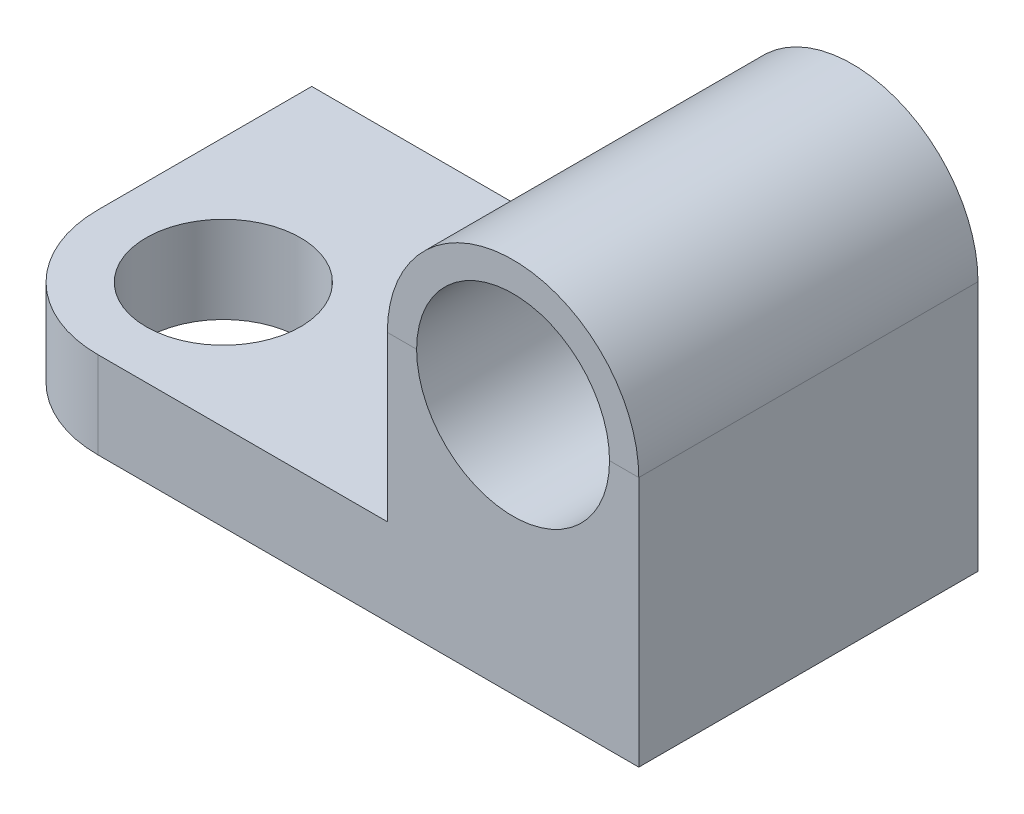
ISO-10303-21;
HEADER;
FILE_DESCRIPTION(('STEP AP214'),'2;1');
FILE_NAME('part.step','',(''),(''),'','','');
FILE_SCHEMA(('AUTOMOTIVE_DESIGN { 1 0 10303 214 1 1 1 1 }'));
ENDSEC;
DATA;
#1=APPLICATION_CONTEXT('core data for automotive mechanical design processes');
#2=APPLICATION_PROTOCOL_DEFINITION('international standard','automotive_design',2000,#1);
#3=PRODUCT_CONTEXT('',#1,'mechanical');
#4=PRODUCT('Part','Part','',(#3));
#5=PRODUCT_RELATED_PRODUCT_CATEGORY('part','',(#4));
#6=PRODUCT_DEFINITION_FORMATION('','',#4);
#7=PRODUCT_DEFINITION_CONTEXT('part definition',#1,'design');
#8=PRODUCT_DEFINITION('design','',#6,#7);
#9=PRODUCT_DEFINITION_SHAPE('','',#8);
#10=(LENGTH_UNIT() NAMED_UNIT(*) SI_UNIT(.MILLI.,.METRE.));
#11=(NAMED_UNIT(*) PLANE_ANGLE_UNIT() SI_UNIT($,.RADIAN.));
#12=(NAMED_UNIT(*) SI_UNIT($,.STERADIAN.) SOLID_ANGLE_UNIT());
#13=UNCERTAINTY_MEASURE_WITH_UNIT(LENGTH_MEASURE(1.E-05),#10,'distance_accuracy_value','');
#14=(GEOMETRIC_REPRESENTATION_CONTEXT(3) GLOBAL_UNCERTAINTY_ASSIGNED_CONTEXT((#13)) GLOBAL_UNIT_ASSIGNED_CONTEXT((#10,
#11,#12)) REPRESENTATION_CONTEXT('',''));
#15=CARTESIAN_POINT('',(0.,0.,0.));
#16=DIRECTION('',(0.,0.,1.));
#17=DIRECTION('',(1.,0.,0.));
#18=AXIS2_PLACEMENT_3D('',#15,#16,#17);
#19=CARTESIAN_POINT('',(13.,9.,0.));
#20=DIRECTION('',(0.,0.,-1.));
#21=DIRECTION('',(-1.,0.,0.));
#22=AXIS2_PLACEMENT_3D('',#19,#20,#21);
#23=PLANE('',#22);
#24=CARTESIAN_POINT('',(56.032299844366,26.,0.));
#25=DIRECTION('',(0.,0.,1.));
#26=DIRECTION('',(-1.,0.,0.));
#27=AXIS2_PLACEMENT_3D('',#24,#25,#26);
#28=CIRCLE('',#27,9.99999999999999);
#29=CARTESIAN_POINT('',(46.032299844366,26.,0.000250000000001226));
#30=VERTEX_POINT('',#29);
#31=CARTESIAN_POINT('',(66.032299844366,26.,0.000249999999999491));
#32=VERTEX_POINT('',#31);
#33=EDGE_CURVE('E63',#30,#32,#28,.T.);
#34=ORIENTED_EDGE('',*,*,#33,.F.);
#35=CARTESIAN_POINT('',(43.,26.,0.0010000000000049));
#36=DIRECTION('',(1.,0.,0.));
#37=VECTOR('',#36,1.);
#38=LINE('',#35,#37);
#39=CARTESIAN_POINT('',(43.,26.,0.000500000000002452));
#40=VERTEX_POINT('',#39);
#41=EDGE_CURVE('E129',#40,#30,#38,.T.);
#42=ORIENTED_EDGE('',*,*,#41,.F.);
#43=DIRECTION('',(0.,-1.,0.));
#44=VECTOR('',#43,1.);
#45=CARTESIAN_POINT('',(43.,26.,0.));
#46=LINE('',#45,#44);
#47=CARTESIAN_POINT('',(43.,9.,0.));
#48=VERTEX_POINT('',#47);
#49=EDGE_CURVE('E219',#40,#48,#46,.T.);
#50=ORIENTED_EDGE('',*,*,#49,.T.);
#51=DIRECTION('',(1.,0.,0.));
#52=VECTOR('',#51,1.);
#53=CARTESIAN_POINT('',(13.,9.,0.));
#54=LINE('',#53,#52);
#55=CARTESIAN_POINT('',(13.,9.,0.));
#56=VERTEX_POINT('',#55);
#57=EDGE_CURVE('E278',#56,#48,#54,.T.);
#58=ORIENTED_EDGE('',*,*,#57,.F.);
#59=DIRECTION('',(0.,-1.,0.));
#60=VECTOR('',#59,1.);
#61=CARTESIAN_POINT('',(13.,9.,0.));
#62=LINE('',#61,#60);
#63=CARTESIAN_POINT('',(13.,0.,0.));
#64=VERTEX_POINT('',#63);
#65=EDGE_CURVE('E12',#56,#64,#62,.T.);
#66=ORIENTED_EDGE('',*,*,#65,.T.);
#67=DIRECTION('',(1.,0.,0.));
#68=VECTOR('',#67,1.);
#69=CARTESIAN_POINT('',(13.,0.,0.));
#70=LINE('',#69,#68);
#71=CARTESIAN_POINT('',(69.0645996887321,0.,0.));
#72=VERTEX_POINT('',#71);
#73=EDGE_CURVE('E291',#64,#72,#70,.T.);
#74=ORIENTED_EDGE('',*,*,#73,.T.);
#75=DIRECTION('',(0.,-1.,0.));
#76=VECTOR('',#75,1.);
#77=CARTESIAN_POINT('',(69.0645996887321,9.,0.));
#78=LINE('',#77,#76);
#79=CARTESIAN_POINT('',(69.0645996887321,26.,0.000500000000002452));
#80=VERTEX_POINT('',#79);
#81=EDGE_CURVE('E60',#80,#72,#78,.T.);
#82=ORIENTED_EDGE('',*,*,#81,.F.);
#83=CARTESIAN_POINT('',(66.032299844366,26.,0.0010000000000049));
#84=DIRECTION('',(1.,0.,0.));
#85=VECTOR('',#84,1.);
#86=LINE('',#83,#85);
#87=EDGE_CURVE('E127',#32,#80,#86,.T.);
#88=ORIENTED_EDGE('',*,*,#87,.F.);
#89=EDGE_LOOP('',(#34,#42,#50,#58,#66,#74,#82,#88));
#90=FACE_BOUND('',#89,.T.);
#91=ADVANCED_FACE('F46',(#90),#23,.F.);
#92=CARTESIAN_POINT('',(13.,9.,-13.));
#93=DIRECTION('',(0.,-1.,0.));
#94=DIRECTION('',(0.,0.,-1.));
#95=AXIS2_PLACEMENT_3D('',#92,#93,#94);
#96=CYLINDRICAL_SURFACE('',#95,13.);
#97=CARTESIAN_POINT('',(13.,0.,-13.));
#98=DIRECTION('',(0.,1.,0.));
#99=DIRECTION('',(0.,0.,1.));
#100=AXIS2_PLACEMENT_3D('',#97,#98,#99);
#101=CIRCLE('',#100,13.);
#102=CARTESIAN_POINT('',(0.,0.,-13.));
#103=VERTEX_POINT('',#102);
#104=EDGE_CURVE('E275',#103,#64,#101,.T.);
#105=ORIENTED_EDGE('',*,*,#104,.T.);
#106=ORIENTED_EDGE('',*,*,#65,.F.);
#107=CARTESIAN_POINT('',(13.,9.,-13.));
#108=DIRECTION('',(0.,1.,0.));
#109=DIRECTION('',(0.,0.,1.));
#110=AXIS2_PLACEMENT_3D('',#107,#108,#109);
#111=CIRCLE('',#110,13.);
#112=CARTESIAN_POINT('',(0.,9.,-13.));
#113=VERTEX_POINT('',#112);
#114=EDGE_CURVE('E273',#113,#56,#111,.T.);
#115=ORIENTED_EDGE('',*,*,#114,.F.);
#116=DIRECTION('',(0.,-1.,0.));
#117=VECTOR('',#116,1.);
#118=CARTESIAN_POINT('',(0.,9.,-13.));
#119=LINE('',#118,#117);
#120=EDGE_CURVE('E289',#113,#103,#119,.T.);
#121=ORIENTED_EDGE('',*,*,#120,.T.);
#122=EDGE_LOOP('',(#105,#106,#115,#121));
#123=FACE_BOUND('',#122,.T.);
#124=ADVANCED_FACE('F48',(#123),#96,.T.);
#125=CARTESIAN_POINT('',(69.0645996887321,9.,0.));
#126=DIRECTION('',(-1.,0.,0.));
#127=DIRECTION('',(0.,0.,1.));
#128=AXIS2_PLACEMENT_3D('',#125,#126,#127);
#129=PLANE('',#128);
#130=DIRECTION('',(0.,0.,-1.));
#131=VECTOR('',#130,1.);
#132=CARTESIAN_POINT('',(69.0645996887321,0.,0.));
#133=LINE('',#132,#131);
#134=CARTESIAN_POINT('',(69.0645996887321,0.,-35.1624539443944));
#135=VERTEX_POINT('',#134);
#136=EDGE_CURVE('E298',#72,#135,#133,.T.);
#137=ORIENTED_EDGE('',*,*,#136,.T.);
#138=DIRECTION('',(0.,-1.,0.));
#139=VECTOR('',#138,1.);
#140=CARTESIAN_POINT('',(69.0645996887321,9.,-35.1624539443944));
#141=LINE('',#140,#139);
#142=CARTESIAN_POINT('',(69.0645996887321,26.,-35.162454));
#143=VERTEX_POINT('',#142);
#144=EDGE_CURVE('E260',#143,#135,#141,.T.);
#145=ORIENTED_EDGE('',*,*,#144,.F.);
#146=DIRECTION('',(0.,0.,-1.));
#147=VECTOR('',#146,1.);
#148=CARTESIAN_POINT('',(69.0645996887321,26.,-35.1624539443944));
#149=LINE('',#148,#147);
#150=EDGE_CURVE('E136',#80,#143,#149,.T.);
#151=ORIENTED_EDGE('',*,*,#150,.F.);
#152=ORIENTED_EDGE('',*,*,#81,.T.);
#153=EDGE_LOOP('',(#137,#145,#151,#152));
#154=FACE_BOUND('',#153,.T.);
#155=ADVANCED_FACE('F189',(#154),#129,.F.);
#156=CARTESIAN_POINT('',(0.,9.,-35.1624539443944));
#157=DIRECTION('',(0.,0.,-1.));
#158=DIRECTION('',(-1.,0.,0.));
#159=AXIS2_PLACEMENT_3D('',#156,#157,#158);
#160=PLANE('',#159);
#161=CARTESIAN_POINT('',(56.032299844366,26.,-35.1624539443944));
#162=DIRECTION('',(0.,0.,-1.));
#163=DIRECTION('',(-1.,0.,0.));
#164=AXIS2_PLACEMENT_3D('',#161,#162,#163);
#165=CIRCLE('',#164,9.99999999999999);
#166=CARTESIAN_POINT('',(46.032299844366,26.,-35.1624539443944));
#167=VERTEX_POINT('',#166);
#168=EDGE_CURVE('E125',#167,#167,#165,.T.);
#169=ORIENTED_EDGE('',*,*,#168,.F.);
#170=EDGE_LOOP('',(#169));
#171=FACE_BOUND('',#170,.T.);
#172=DIRECTION('',(0.,-1.,0.));
#173=VECTOR('',#172,1.);
#174=CARTESIAN_POINT('',(43.,26.,-35.1624539443944));
#175=LINE('',#174,#173);
#176=CARTESIAN_POINT('',(43.,26.,-35.1624539443944));
#177=VERTEX_POINT('',#176);
#178=CARTESIAN_POINT('',(43.,9.,-35.1624539443944));
#179=VERTEX_POINT('',#178);
#180=EDGE_CURVE('E225',#177,#179,#175,.T.);
#181=ORIENTED_EDGE('',*,*,#180,.F.);
#182=CARTESIAN_POINT('',(56.032299844366,26.,-35.162454));
#183=DIRECTION('',(0.,0.,1.));
#184=DIRECTION('',(1.,0.,0.));
#185=AXIS2_PLACEMENT_3D('',#182,#183,#184);
#186=CIRCLE('',#185,13.032299844366);
#187=EDGE_CURVE('E224',#143,#177,#186,.T.);
#188=ORIENTED_EDGE('',*,*,#187,.F.);
#189=ORIENTED_EDGE('',*,*,#144,.T.);
#190=DIRECTION('',(1.,0.,0.));
#191=VECTOR('',#190,1.);
#192=CARTESIAN_POINT('',(0.,0.,-35.1624539443944));
#193=LINE('',#192,#191);
#194=CARTESIAN_POINT('',(0.,0.,-35.1624539443944));
#195=VERTEX_POINT('',#194);
#196=EDGE_CURVE('E297',#195,#135,#193,.T.);
#197=ORIENTED_EDGE('',*,*,#196,.F.);
#198=DIRECTION('',(0.,-1.,0.));
#199=VECTOR('',#198,1.);
#200=CARTESIAN_POINT('',(0.,9.,-35.1624539443944));
#201=LINE('',#200,#199);
#202=CARTESIAN_POINT('',(0.,9.,-35.1624539443944));
#203=VERTEX_POINT('',#202);
#204=EDGE_CURVE('E307',#203,#195,#201,.T.);
#205=ORIENTED_EDGE('',*,*,#204,.F.);
#206=DIRECTION('',(1.,0.,0.));
#207=VECTOR('',#206,1.);
#208=CARTESIAN_POINT('',(0.,9.,-35.1624539443944));
#209=LINE('',#208,#207);
#210=EDGE_CURVE('E246',#203,#179,#209,.T.);
#211=ORIENTED_EDGE('',*,*,#210,.T.);
#212=EDGE_LOOP('',(#181,#188,#189,#197,#205,#211));
#213=FACE_BOUND('',#212,.T.);
#214=ADVANCED_FACE('F191',(#171,#213),#160,.T.);
#215=CARTESIAN_POINT('',(0.,9.,-13.));
#216=DIRECTION('',(-1.,0.,0.));
#217=DIRECTION('',(0.,0.,1.));
#218=AXIS2_PLACEMENT_3D('',#215,#216,#217);
#219=PLANE('',#218);
#220=DIRECTION('',(0.,0.,-1.));
#221=VECTOR('',#220,1.);
#222=CARTESIAN_POINT('',(0.,0.,-13.));
#223=LINE('',#222,#221);
#224=EDGE_CURVE('E277',#103,#195,#223,.T.);
#225=ORIENTED_EDGE('',*,*,#224,.F.);
#226=ORIENTED_EDGE('',*,*,#120,.F.);
#227=DIRECTION('',(0.,0.,-1.));
#228=VECTOR('',#227,1.);
#229=CARTESIAN_POINT('',(0.,9.,-13.));
#230=LINE('',#229,#228);
#231=EDGE_CURVE('E284',#113,#203,#230,.T.);
#232=ORIENTED_EDGE('',*,*,#231,.T.);
#233=ORIENTED_EDGE('',*,*,#204,.T.);
#234=EDGE_LOOP('',(#225,#226,#232,#233));
#235=FACE_BOUND('',#234,.T.);
#236=ADVANCED_FACE('F196',(#235),#219,.T.);
#237=CARTESIAN_POINT('',(13.,9.,-13.));
#238=DIRECTION('',(0.,1.,0.));
#239=DIRECTION('',(0.,0.,1.));
#240=AXIS2_PLACEMENT_3D('',#237,#238,#239);
#241=PLANE('',#240);
#242=DIRECTION('',(0.,0.,1.));
#243=VECTOR('',#242,1.);
#244=CARTESIAN_POINT('',(43.,9.,-35.1624539443944));
#245=LINE('',#244,#243);
#246=EDGE_CURVE('E73',#179,#48,#245,.T.);
#247=ORIENTED_EDGE('',*,*,#246,.F.);
#248=ORIENTED_EDGE('',*,*,#210,.F.);
#249=ORIENTED_EDGE('',*,*,#231,.F.);
#250=ORIENTED_EDGE('',*,*,#114,.T.);
#251=ORIENTED_EDGE('',*,*,#57,.T.);
#252=EDGE_LOOP('',(#247,#248,#249,#250,#251));
#253=FACE_BOUND('',#252,.T.);
#254=CARTESIAN_POINT('',(13.,9.,-13.));
#255=DIRECTION('',(0.,1.,0.));
#256=DIRECTION('',(0.,0.,1.));
#257=AXIS2_PLACEMENT_3D('',#254,#255,#256);
#258=CIRCLE('',#257,8.);
#259=CARTESIAN_POINT('',(13.,9.,-5.));
#260=VERTEX_POINT('',#259);
#261=EDGE_CURVE('E265',#260,#260,#258,.T.);
#262=ORIENTED_EDGE('',*,*,#261,.F.);
#263=EDGE_LOOP('',(#262));
#264=FACE_BOUND('',#263,.T.);
#265=ADVANCED_FACE('F199',(#253,#264),#241,.T.);
#266=CARTESIAN_POINT('',(13.,0.,-13.));
#267=DIRECTION('',(0.,1.,0.));
#268=DIRECTION('',(0.,0.,1.));
#269=AXIS2_PLACEMENT_3D('',#266,#267,#268);
#270=PLANE('',#269);
#271=CARTESIAN_POINT('',(13.,0.,-13.));
#272=DIRECTION('',(0.,1.,0.));
#273=DIRECTION('',(0.,0.,1.));
#274=AXIS2_PLACEMENT_3D('',#271,#272,#273);
#275=CIRCLE('',#274,8.);
#276=CARTESIAN_POINT('',(13.,0.,-5.));
#277=VERTEX_POINT('',#276);
#278=EDGE_CURVE('E267',#277,#277,#275,.T.);
#279=ORIENTED_EDGE('',*,*,#278,.T.);
#280=EDGE_LOOP('',(#279));
#281=FACE_BOUND('',#280,.T.);
#282=ORIENTED_EDGE('',*,*,#104,.F.);
#283=ORIENTED_EDGE('',*,*,#224,.T.);
#284=ORIENTED_EDGE('',*,*,#196,.T.);
#285=ORIENTED_EDGE('',*,*,#136,.F.);
#286=ORIENTED_EDGE('',*,*,#73,.F.);
#287=EDGE_LOOP('',(#282,#283,#284,#285,#286));
#288=FACE_BOUND('',#287,.T.);
#289=ADVANCED_FACE('F205',(#281,#288),#270,.F.);
#290=CARTESIAN_POINT('',(13.,0.,-13.));
#291=DIRECTION('',(0.,1.,0.));
#292=DIRECTION('',(0.,0.,1.));
#293=AXIS2_PLACEMENT_3D('',#290,#291,#292);
#294=CYLINDRICAL_SURFACE('',#293,8.);
#295=ORIENTED_EDGE('',*,*,#278,.F.);
#296=EDGE_LOOP('',(#295));
#297=FACE_BOUND('',#296,.T.);
#298=ORIENTED_EDGE('',*,*,#261,.T.);
#299=EDGE_LOOP('',(#298));
#300=FACE_BOUND('',#299,.T.);
#301=ADVANCED_FACE('F201',(#297,#300),#294,.F.);
#302=CARTESIAN_POINT('',(43.,26.,-35.1624539443944));
#303=DIRECTION('',(1.,0.,0.));
#304=DIRECTION('',(0.,0.,-1.));
#305=AXIS2_PLACEMENT_3D('',#302,#303,#304);
#306=PLANE('',#305);
#307=ORIENTED_EDGE('',*,*,#246,.T.);
#308=ORIENTED_EDGE('',*,*,#49,.F.);
#309=DIRECTION('',(0.,0.,1.));
#310=VECTOR('',#309,1.);
#311=CARTESIAN_POINT('',(43.,26.,-35.1624539443944));
#312=LINE('',#311,#310);
#313=EDGE_CURVE('E180',#177,#40,#312,.T.);
#314=ORIENTED_EDGE('',*,*,#313,.F.);
#315=ORIENTED_EDGE('',*,*,#180,.T.);
#316=EDGE_LOOP('',(#307,#308,#314,#315));
#317=FACE_BOUND('',#316,.T.);
#318=ADVANCED_FACE('F208',(#317),#306,.F.);
#319=CARTESIAN_POINT('',(56.032299844366,26.,-35.162454));
#320=DIRECTION('',(0.,0.,1.));
#321=DIRECTION('',(1.,0.,0.));
#322=AXIS2_PLACEMENT_3D('',#319,#320,#321);
#323=CYLINDRICAL_SURFACE('',#322,13.032299844366);
#324=ORIENTED_EDGE('',*,*,#187,.T.);
#325=ORIENTED_EDGE('',*,*,#313,.T.);
#326=CARTESIAN_POINT('',(56.032299844366,26.,0.0010000000000049));
#327=DIRECTION('',(0.,0.,1.));
#328=DIRECTION('',(1.,0.,0.));
#329=AXIS2_PLACEMENT_3D('',#326,#327,#328);
#330=CIRCLE('',#329,13.032299844366);
#331=EDGE_CURVE('E138',#80,#40,#330,.T.);
#332=ORIENTED_EDGE('',*,*,#331,.F.);
#333=ORIENTED_EDGE('',*,*,#150,.T.);
#334=EDGE_LOOP('',(#324,#325,#332,#333));
#335=FACE_BOUND('',#334,.T.);
#336=ADVANCED_FACE('F156',(#335),#323,.T.);
#337=CARTESIAN_POINT('',(56.032299844366,26.,0.0010000000000049));
#338=DIRECTION('',(0.,0.,1.));
#339=DIRECTION('',(1.,0.,0.));
#340=AXIS2_PLACEMENT_3D('',#337,#338,#339);
#341=PLANE('',#340);
#342=CARTESIAN_POINT('',(56.032299844366,26.,0.));
#343=DIRECTION('',(0.,0.,1.));
#344=DIRECTION('',(1.,0.,0.));
#345=AXIS2_PLACEMENT_3D('',#342,#343,#344);
#346=CIRCLE('',#345,9.99999999999999);
#347=EDGE_CURVE('E112',#32,#30,#346,.T.);
#348=ORIENTED_EDGE('',*,*,#347,.F.);
#349=ORIENTED_EDGE('',*,*,#87,.T.);
#350=ORIENTED_EDGE('',*,*,#331,.T.);
#351=ORIENTED_EDGE('',*,*,#41,.T.);
#352=EDGE_LOOP('',(#348,#349,#350,#351));
#353=FACE_BOUND('',#352,.T.);
#354=ADVANCED_FACE('F137',(#353),#341,.T.);
#355=CARTESIAN_POINT('',(56.032299844366,26.,-36.));
#356=DIRECTION('',(0.,0.,1.));
#357=DIRECTION('',(1.,0.,0.));
#358=AXIS2_PLACEMENT_3D('',#355,#356,#357);
#359=CYLINDRICAL_SURFACE('',#358,9.99999999999999);
#360=ORIENTED_EDGE('',*,*,#168,.T.);
#361=EDGE_LOOP('',(#360));
#362=FACE_BOUND('',#361,.T.);
#363=ORIENTED_EDGE('',*,*,#347,.T.);
#364=ORIENTED_EDGE('',*,*,#33,.T.);
#365=EDGE_LOOP('',(#363,#364));
#366=FACE_BOUND('',#365,.T.);
#367=ADVANCED_FACE('F116',(#362,#366),#359,.F.);
#368=CLOSED_SHELL('',(#91,#124,#155,#214,#236,#265,#289,#301,#318,#336,#354,#367));
#369=MANIFOLD_SOLID_BREP('B2',#368);
#370=ADVANCED_BREP_SHAPE_REPRESENTATION('',(#18,#369),#14);
#371=SHAPE_DEFINITION_REPRESENTATION(#9,#370);
ENDSEC;
END-ISO-10303-21;
